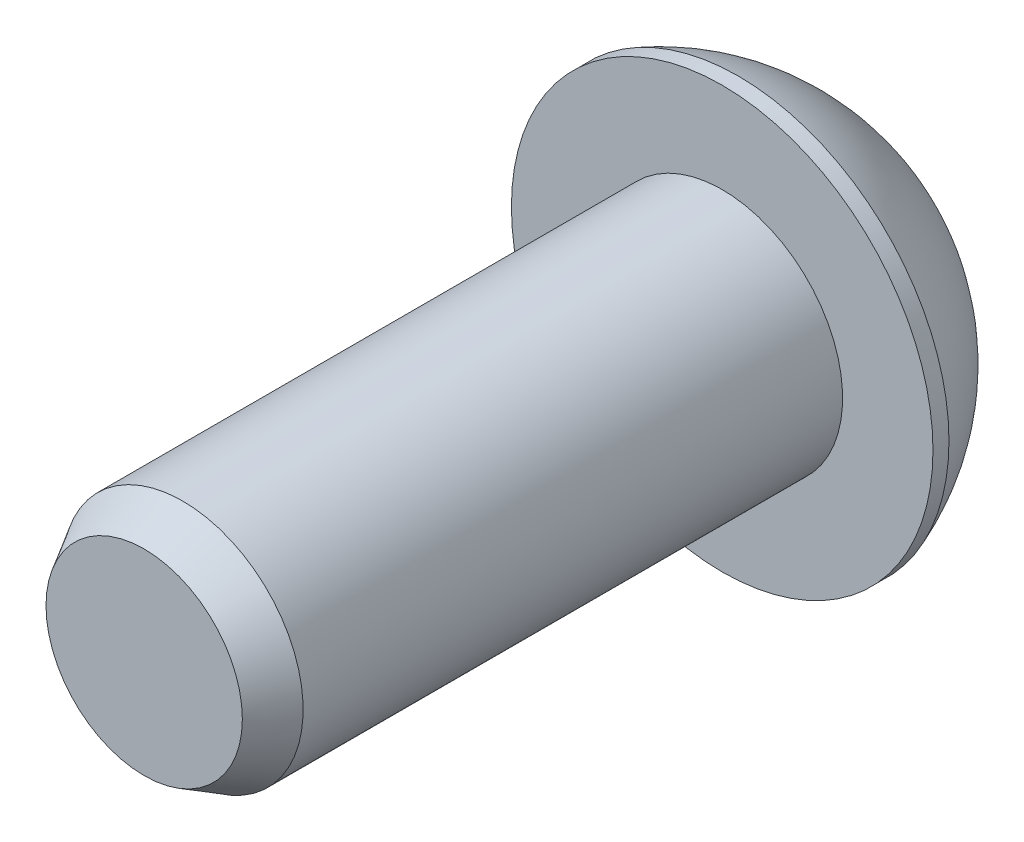
ISO-10303-21;
HEADER;
FILE_DESCRIPTION(('STEP AP214'),'2;1');
FILE_NAME('part.step','',(''),(''),'','','');
FILE_SCHEMA(('AUTOMOTIVE_DESIGN { 1 0 10303 214 1 1 1 1 }'));
ENDSEC;
DATA;
#1=APPLICATION_CONTEXT('core data for automotive mechanical design processes');
#2=APPLICATION_PROTOCOL_DEFINITION('international standard','automotive_design',2000,#1);
#3=PRODUCT_CONTEXT('',#1,'mechanical');
#4=PRODUCT('Part','Part','',(#3));
#5=PRODUCT_RELATED_PRODUCT_CATEGORY('part','',(#4));
#6=PRODUCT_DEFINITION_FORMATION('','',#4);
#7=PRODUCT_DEFINITION_CONTEXT('part definition',#1,'design');
#8=PRODUCT_DEFINITION('design','',#6,#7);
#9=PRODUCT_DEFINITION_SHAPE('','',#8);
#10=(LENGTH_UNIT() NAMED_UNIT(*) SI_UNIT(.MILLI.,.METRE.));
#11=(NAMED_UNIT(*) PLANE_ANGLE_UNIT() SI_UNIT($,.RADIAN.));
#12=(NAMED_UNIT(*) SI_UNIT($,.STERADIAN.) SOLID_ANGLE_UNIT());
#13=UNCERTAINTY_MEASURE_WITH_UNIT(LENGTH_MEASURE(1.E-05),#10,'distance_accuracy_value','');
#14=(GEOMETRIC_REPRESENTATION_CONTEXT(3) GLOBAL_UNCERTAINTY_ASSIGNED_CONTEXT((#13)) GLOBAL_UNIT_ASSIGNED_CONTEXT((#10,
#11,#12)) REPRESENTATION_CONTEXT('',''));
#15=CARTESIAN_POINT('',(0.,0.,0.));
#16=DIRECTION('',(0.,0.,1.));
#17=DIRECTION('',(1.,0.,0.));
#18=AXIS2_PLACEMENT_3D('',#15,#16,#17);
#19=CARTESIAN_POINT('',(6.94689994485843,0.,4.21640000000001));
#20=DIRECTION('',(0.,0.,1.));
#21=DIRECTION('',(1.,0.,0.));
#22=AXIS2_PLACEMENT_3D('',#19,#20,#21);
#23=PLANE('',#22);
#24=CARTESIAN_POINT('',(-2.84133281139298E-08,0.,4.21640000000001));
#25=DIRECTION('',(0.,0.,1.));
#26=DIRECTION('',(1.,0.,0.));
#27=AXIS2_PLACEMENT_3D('',#24,#25,#26);
#28=CIRCLE('',#27,6.94689997327175);
#29=CARTESIAN_POINT('',(6.94689994485843,0.,4.21640000000001));
#30=VERTEX_POINT('',#29);
#31=EDGE_CURVE('E145',#30,#30,#28,.T.);
#32=ORIENTED_EDGE('',*,*,#31,.T.);
#33=EDGE_LOOP('',(#32));
#34=FACE_BOUND('',#33,.T.);
#35=CARTESIAN_POINT('',(0.,0.,4.21640000000001));
#36=DIRECTION('',(0.,0.,1.));
#37=DIRECTION('',(1.,0.,0.));
#38=AXIS2_PLACEMENT_3D('',#35,#36,#37);
#39=CIRCLE('',#38,3.96875);
#40=CARTESIAN_POINT('',(-3.96875,0.,4.21640000000001));
#41=VERTEX_POINT('',#40);
#42=EDGE_CURVE('E124',#41,#41,#39,.T.);
#43=ORIENTED_EDGE('',*,*,#42,.F.);
#44=EDGE_LOOP('',(#43));
#45=FACE_BOUND('',#44,.T.);
#46=ADVANCED_FACE('F34',(#34,#45),#23,.T.);
#47=CARTESIAN_POINT('',(-2.67282055155249E-08,0.,6.25721458691914));
#48=DIRECTION('',(0.,0.,1.));
#49=DIRECTION('',(1.,0.,0.));
#50=AXIS2_PLACEMENT_3D('',#47,#48,#49);
#51=SPHERICAL_SURFACE('',#50,7.40630461839997);
#52=CARTESIAN_POINT('',(-2.84133281139298E-08,0.,0.));
#53=DIRECTION('',(0.,0.,1.));
#54=DIRECTION('',(1.,0.,0.));
#55=AXIS2_PLACEMENT_3D('',#52,#53,#54);
#56=CIRCLE('',#55,3.96239999585268);
#57=CARTESIAN_POINT('',(3.96239996743935,0.,0.));
#58=VERTEX_POINT('',#57);
#59=EDGE_CURVE('E148',#58,#58,#56,.T.);
#60=CARTESIAN_POINT('',(-2.84133281139298E-08,0.,3.68934993213253));
#61=DIRECTION('',(0.,0.,1.));
#62=DIRECTION('',(1.,0.,0.));
#63=AXIS2_PLACEMENT_3D('',#60,#61,#62);
#64=CIRCLE('',#63,6.94689997327175);
#65=CARTESIAN_POINT('',(6.94689994485843,0.,3.68934993213253));
#66=VERTEX_POINT('',#65);
#67=EDGE_CURVE('E137',#66,#66,#64,.T.);
#68=CARTESIAN_POINT('',(3.96239996743935,0.,0.));
#69=CARTESIAN_POINT('',(4.00491122832903,0.,0.0269202935423318));
#70=CARTESIAN_POINT('',(4.04714806312185,0.,0.0542739413594867));
#71=CARTESIAN_POINT('',(4.13105552059287,0.,0.10983630254456));
#72=CARTESIAN_POINT('',(4.17272614327109,0.,0.138045015912478));
#73=CARTESIAN_POINT('',(4.25548381659206,0.,0.195305865200196));
#74=CARTESIAN_POINT('',(4.29657086723481,0.,0.224358001119995));
#75=CARTESIAN_POINT('',(4.37814434200689,0.,0.283293606974706));
#76=CARTESIAN_POINT('',(4.41863076613622,0.,0.313177076909618));
#77=CARTESIAN_POINT('',(4.49898616602004,0.,0.373762942419019));
#78=CARTESIAN_POINT('',(4.53885514177452,0.,0.404465337993508));
#79=CARTESIAN_POINT('',(4.61795908406372,0.,0.466676299386842));
#80=CARTESIAN_POINT('',(4.65719405059842,0.,0.498184865205687));
#81=CARTESIAN_POINT('',(4.73501367576176,0.,0.561995078635741));
#82=CARTESIAN_POINT('',(4.77359833439039,0.,0.594296726246949));
#83=CARTESIAN_POINT('',(4.85010131552178,0.,0.659679684868404));
#84=CARTESIAN_POINT('',(4.88801963802453,0.,0.69276099587865));
#85=CARTESIAN_POINT('',(4.96317419539715,0.,0.75968953915967));
#86=CARTESIAN_POINT('',(5.00041043026703,0.,0.793536771430443));
#87=CARTESIAN_POINT('',(5.07418534423334,0.,0.861983096890693));
#88=CARTESIAN_POINT('',(5.11072402332977,0.,0.89658219008017));
#89=CARTESIAN_POINT('',(5.18308864737106,0.,0.966517864718109));
#90=CARTESIAN_POINT('',(5.21891459231591,0.,1.00185444616657));
#91=CARTESIAN_POINT('',(5.28983886575141,0.,1.07325041830338));
#92=CARTESIAN_POINT('',(5.32493719424207,0.,1.10930980899173));
#93=CARTESIAN_POINT('',(5.39439165472216,0.,1.18213642033078));
#94=CARTESIAN_POINT('',(5.4287477867116,0.,1.21890364098148));
#95=CARTESIAN_POINT('',(5.49670358245505,0.,1.29313063893092));
#96=CARTESIAN_POINT('',(5.53030324620907,0.,1.33059041622965));
#97=CARTESIAN_POINT('',(5.59673214798866,0.,1.40618696646884));
#98=CARTESIAN_POINT('',(5.62956138601425,0.,1.44432373940931));
#99=CARTESIAN_POINT('',(5.69443579888326,0.,1.52125843869782));
#100=CARTESIAN_POINT('',(5.72648097372668,0.,1.56005636504585));
#101=CARTESIAN_POINT('',(5.78977394848199,0.,1.6382972542684));
#102=CARTESIAN_POINT('',(5.82102174839387,0.,1.67774021714292));
#103=CARTESIAN_POINT('',(5.88270699277081,0.,1.75725479458547));
#104=CARTESIAN_POINT('',(5.91314443723587,0.,1.79732640915351));
#105=CARTESIAN_POINT('',(5.97319632683021,0.,1.87808164400463));
#106=CARTESIAN_POINT('',(6.00281077195948,0.,1.91876526428772));
#107=CARTESIAN_POINT('',(6.06120436087193,0.,2.00072761035977));
#108=CARTESIAN_POINT('',(6.08998350465511,0.,2.04200633614874));
#109=CARTESIAN_POINT('',(6.14669453585395,0.,2.12514174581318));
#110=CARTESIAN_POINT('',(6.17462642326962,0.,2.16699842968865));
#111=CARTESIAN_POINT('',(6.22963133866741,0.,2.25127236801952));
#112=CARTESIAN_POINT('',(6.25670436664953,0.,2.29368962247493));
#113=CARTESIAN_POINT('',(6.30998031688856,0.,2.37906708159517));
#114=CARTESIAN_POINT('',(6.33618323914547,0.,2.42202728626001));
#115=CARTESIAN_POINT('',(6.38770809309214,0.,2.50847279988288));
#116=CARTESIAN_POINT('',(6.4130300247819,0.,2.5519581088409));
#117=CARTESIAN_POINT('',(6.46278237871033,0.,2.63943576700672));
#118=CARTESIAN_POINT('',(6.487212800949,0.,2.6834281162145));
#119=CARTESIAN_POINT('',(6.53517198746878,0.,2.77190158019351));
#120=CARTESIAN_POINT('',(6.55870075174988,0.,2.81638269496474));
#121=CARTESIAN_POINT('',(6.60484684825518,0.,2.90581521240596));
#122=CARTESIAN_POINT('',(6.62746418047938,0.,2.95076661507596));
#123=CARTESIAN_POINT('',(6.67177801793329,0.,3.04112103507456));
#124=CARTESIAN_POINT('',(6.693474523163,0.,3.08652405240316));
#125=CARTESIAN_POINT('',(6.73593769216331,0.,3.17776284167868));
#126=CARTESIAN_POINT('',(6.7567043559339,0.,3.22359861362559));
#127=CARTESIAN_POINT('',(6.7972992214406,0.,3.31568386933109));
#128=CARTESIAN_POINT('',(6.81712742317669,0.,3.36193335308968));
#129=CARTESIAN_POINT('',(6.85583710541432,0.,3.45482682894085));
#130=CARTESIAN_POINT('',(6.87471858591584,0.,3.50147082103345));
#131=CARTESIAN_POINT('',(6.91152706599869,0.,3.59513390444256));
#132=CARTESIAN_POINT('',(6.92945406558002,0.,3.64215299575909));
#133=CARTESIAN_POINT('',(6.94689994485843,0.,3.68934993213253));
#134=B_SPLINE_CURVE_WITH_KNOTS('',3,(#68,#69,#70,#71,#72,#73,#74,#75,#76,#77,#78,#79,#80,#81,
#82,#83,#84,#85,#86,#87,#88,#89,#90,#91,#92,#93,#94,#95,#96,#97,#98,#99,#100,#101,#102,#103,
#104,#105,#106,#107,#108,#109,#110,#111,#112,#113,#114,#115,#116,#117,#118,#119,#120,#121,#122,
#123,#124,#125,#126,#127,#128,#129,#130,#131,#132,#133),.UNSPECIFIED.,.F.,.F.,(4,2,2,2,2,2,2,2,
2,2,2,2,2,2,2,2,2,2,2,2,2,2,2,2,2,2,2,2,2,2,2,2,4),(0.,0.15095163248343,0.301903264966859,
0.452854897450289,0.603806529933719,0.754758162417149,0.905709794900579,1.05666142738401,
1.20761305986744,1.35856469235087,1.5095163248343,1.66046795731773,1.81141958980116,
1.96237122228459,2.11332285476802,2.26427448725145,2.41522611973488,2.56617775221831,
2.71712938470174,2.86808101718517,3.0190326496686,3.16998428215203,3.32093591463546,
3.47188754711889,3.62283917960231,3.77379081208575,3.92474244456917,4.0756940770526,
4.22664570953603,4.37759734201946,4.52854897450289,4.67950060698632,4.83045223946975),.UNSPECIFIED.);
#135=EDGE_CURVE('BSEAM165',#58,#66,#134,.T.);
#136=ORIENTED_EDGE('',*,*,#59,.T.);
#137=ORIENTED_EDGE('',*,*,#67,.F.);
#138=ORIENTED_EDGE('',*,*,#135,.T.);
#139=ORIENTED_EDGE('',*,*,#135,.F.);
#140=EDGE_LOOP('',(#136,#138,#137,#139));
#141=FACE_BOUND('',#140,.T.);
#142=ADVANCED_FACE('F165',(#141),#51,.T.);
#143=CARTESIAN_POINT('',(-2.84133281139298E-08,0.,0.));
#144=DIRECTION('',(0.,0.,-1.));
#145=DIRECTION('',(-1.,0.,0.));
#146=AXIS2_PLACEMENT_3D('',#143,#144,#145);
#147=PLANE('',#146);
#148=DIRECTION('',(-0.5,0.866025403784439,0.));
#149=VECTOR('',#148,1.);
#150=CARTESIAN_POINT('',(-1.3748153285078,-2.38125,0.));
#151=LINE('',#150,#149);
#152=CARTESIAN_POINT('',(-1.3748153285078,-2.38125,0.));
#153=VERTEX_POINT('',#152);
#154=CARTESIAN_POINT('',(-2.74963065701559,0.,0.));
#155=VERTEX_POINT('',#154);
#156=EDGE_CURVE('E49',#153,#155,#151,.T.);
#157=ORIENTED_EDGE('',*,*,#156,.F.);
#158=DIRECTION('',(-1.,0.,0.));
#159=VECTOR('',#158,1.);
#160=CARTESIAN_POINT('',(1.3748153285078,-2.38125,0.));
#161=LINE('',#160,#159);
#162=CARTESIAN_POINT('',(1.3748153285078,-2.38125,0.));
#163=VERTEX_POINT('',#162);
#164=EDGE_CURVE('E133',#163,#153,#161,.T.);
#165=ORIENTED_EDGE('',*,*,#164,.F.);
#166=DIRECTION('',(-0.500000000000001,-0.866025403784438,0.));
#167=VECTOR('',#166,1.);
#168=CARTESIAN_POINT('',(2.7496306570156,0.,0.));
#169=LINE('',#168,#167);
#170=CARTESIAN_POINT('',(2.7496306570156,0.,0.));
#171=VERTEX_POINT('',#170);
#172=EDGE_CURVE('E131',#171,#163,#169,.T.);
#173=ORIENTED_EDGE('',*,*,#172,.F.);
#174=DIRECTION('',(0.5,-0.866025403784439,0.));
#175=VECTOR('',#174,1.);
#176=CARTESIAN_POINT('',(1.3748153285078,2.38125,0.));
#177=LINE('',#176,#175);
#178=CARTESIAN_POINT('',(1.3748153285078,2.38125,0.));
#179=VERTEX_POINT('',#178);
#180=EDGE_CURVE('E97',#179,#171,#177,.T.);
#181=ORIENTED_EDGE('',*,*,#180,.F.);
#182=DIRECTION('',(1.,0.,0.));
#183=VECTOR('',#182,1.);
#184=CARTESIAN_POINT('',(-1.3748153285078,2.38125,0.));
#185=LINE('',#184,#183);
#186=CARTESIAN_POINT('',(-1.3748153285078,2.38125,0.));
#187=VERTEX_POINT('',#186);
#188=EDGE_CURVE('E127',#187,#179,#185,.T.);
#189=ORIENTED_EDGE('',*,*,#188,.F.);
#190=DIRECTION('',(0.5,0.866025403784439,0.));
#191=VECTOR('',#190,1.);
#192=CARTESIAN_POINT('',(-2.74963065701559,0.,0.));
#193=LINE('',#192,#191);
#194=EDGE_CURVE('E123',#155,#187,#193,.T.);
#195=ORIENTED_EDGE('',*,*,#194,.F.);
#196=EDGE_LOOP('',(#157,#165,#173,#181,#189,#195));
#197=FACE_BOUND('',#196,.T.);
#198=ORIENTED_EDGE('',*,*,#59,.F.);
#199=EDGE_LOOP('',(#198));
#200=FACE_BOUND('',#199,.T.);
#201=ADVANCED_FACE('F171',(#197,#200),#147,.T.);
#202=CARTESIAN_POINT('',(-2.84133281139298E-08,0.,0.));
#203=DIRECTION('',(0.,0.,1.));
#204=DIRECTION('',(1.,0.,0.));
#205=AXIS2_PLACEMENT_3D('',#202,#203,#204);
#206=CYLINDRICAL_SURFACE('',#205,6.94689997327175);
#207=ORIENTED_EDGE('',*,*,#67,.T.);
#208=EDGE_LOOP('',(#207));
#209=FACE_BOUND('',#208,.T.);
#210=ORIENTED_EDGE('',*,*,#31,.F.);
#211=EDGE_LOOP('',(#210));
#212=FACE_BOUND('',#211,.T.);
#213=ADVANCED_FACE('F176',(#209,#212),#206,.T.);
#214=CARTESIAN_POINT('',(-1.3748153285078,-2.38125,2.2225));
#215=DIRECTION('',(-0.866025403784439,-0.5,0.));
#216=DIRECTION('',(0.5,-0.866025403784439,0.));
#217=AXIS2_PLACEMENT_3D('',#214,#215,#216);
#218=PLANE('',#217);
#219=ORIENTED_EDGE('',*,*,#156,.T.);
#220=DIRECTION('',(0.,0.,-1.));
#221=VECTOR('',#220,1.);
#222=CARTESIAN_POINT('',(-2.74963065701559,0.,2.2225));
#223=LINE('',#222,#221);
#224=CARTESIAN_POINT('',(-2.74963065701559,0.,2.2225));
#225=VERTEX_POINT('',#224);
#226=EDGE_CURVE('E79',#225,#155,#223,.T.);
#227=ORIENTED_EDGE('',*,*,#226,.F.);
#228=DIRECTION('',(-0.5,0.866025403784439,0.));
#229=VECTOR('',#228,1.);
#230=CARTESIAN_POINT('',(-1.3748153285078,-2.38125,2.2225));
#231=LINE('',#230,#229);
#232=CARTESIAN_POINT('',(-1.3748153285078,-2.38125,2.2225));
#233=VERTEX_POINT('',#232);
#234=EDGE_CURVE('E135',#233,#225,#231,.T.);
#235=ORIENTED_EDGE('',*,*,#234,.F.);
#236=DIRECTION('',(0.,0.,-1.));
#237=VECTOR('',#236,1.);
#238=CARTESIAN_POINT('',(-1.3748153285078,-2.38125,2.2225));
#239=LINE('',#238,#237);
#240=EDGE_CURVE('E57',#233,#153,#239,.T.);
#241=ORIENTED_EDGE('',*,*,#240,.T.);
#242=EDGE_LOOP('',(#219,#227,#235,#241));
#243=FACE_BOUND('',#242,.T.);
#244=ADVANCED_FACE('F183',(#243),#218,.F.);
#245=CARTESIAN_POINT('',(1.3748153285078,-2.38125,2.2225));
#246=DIRECTION('',(0.,-1.,0.));
#247=DIRECTION('',(1.,0.,0.));
#248=AXIS2_PLACEMENT_3D('',#245,#246,#247);
#249=PLANE('',#248);
#250=ORIENTED_EDGE('',*,*,#164,.T.);
#251=ORIENTED_EDGE('',*,*,#240,.F.);
#252=DIRECTION('',(-1.,0.,0.));
#253=VECTOR('',#252,1.);
#254=CARTESIAN_POINT('',(1.3748153285078,-2.38125,2.2225));
#255=LINE('',#254,#253);
#256=CARTESIAN_POINT('',(1.3748153285078,-2.38125,2.2225));
#257=VERTEX_POINT('',#256);
#258=EDGE_CURVE('E109',#257,#233,#255,.T.);
#259=ORIENTED_EDGE('',*,*,#258,.F.);
#260=DIRECTION('',(0.,0.,-1.));
#261=VECTOR('',#260,1.);
#262=CARTESIAN_POINT('',(1.3748153285078,-2.38125,2.2225));
#263=LINE('',#262,#261);
#264=EDGE_CURVE('E101',#257,#163,#263,.T.);
#265=ORIENTED_EDGE('',*,*,#264,.T.);
#266=EDGE_LOOP('',(#250,#251,#259,#265));
#267=FACE_BOUND('',#266,.T.);
#268=ADVANCED_FACE('F209',(#267),#249,.F.);
#269=CARTESIAN_POINT('',(2.7496306570156,0.,2.2225));
#270=DIRECTION('',(0.866025403784438,-0.500000000000001,0.));
#271=DIRECTION('',(0.500000000000001,0.866025403784438,0.));
#272=AXIS2_PLACEMENT_3D('',#269,#270,#271);
#273=PLANE('',#272);
#274=ORIENTED_EDGE('',*,*,#172,.T.);
#275=ORIENTED_EDGE('',*,*,#264,.F.);
#276=DIRECTION('',(-0.500000000000001,-0.866025403784438,0.));
#277=VECTOR('',#276,1.);
#278=CARTESIAN_POINT('',(2.7496306570156,0.,2.2225));
#279=LINE('',#278,#277);
#280=CARTESIAN_POINT('',(2.7496306570156,0.,2.2225));
#281=VERTEX_POINT('',#280);
#282=EDGE_CURVE('E105',#281,#257,#279,.T.);
#283=ORIENTED_EDGE('',*,*,#282,.F.);
#284=DIRECTION('',(0.,0.,-1.));
#285=VECTOR('',#284,1.);
#286=CARTESIAN_POINT('',(2.7496306570156,0.,2.2225));
#287=LINE('',#286,#285);
#288=EDGE_CURVE('E90',#281,#171,#287,.T.);
#289=ORIENTED_EDGE('',*,*,#288,.T.);
#290=EDGE_LOOP('',(#274,#275,#283,#289));
#291=FACE_BOUND('',#290,.T.);
#292=ADVANCED_FACE('F106',(#291),#273,.F.);
#293=CARTESIAN_POINT('',(1.3748153285078,2.38125,2.2225));
#294=DIRECTION('',(0.866025403784439,0.5,0.));
#295=DIRECTION('',(-0.5,0.866025403784439,0.));
#296=AXIS2_PLACEMENT_3D('',#293,#294,#295);
#297=PLANE('',#296);
#298=ORIENTED_EDGE('',*,*,#180,.T.);
#299=ORIENTED_EDGE('',*,*,#288,.F.);
#300=DIRECTION('',(0.5,-0.866025403784439,0.));
#301=VECTOR('',#300,1.);
#302=CARTESIAN_POINT('',(1.3748153285078,2.38125,2.2225));
#303=LINE('',#302,#301);
#304=CARTESIAN_POINT('',(1.3748153285078,2.38125,2.2225));
#305=VERTEX_POINT('',#304);
#306=EDGE_CURVE('E94',#305,#281,#303,.T.);
#307=ORIENTED_EDGE('',*,*,#306,.F.);
#308=DIRECTION('',(0.,0.,-1.));
#309=VECTOR('',#308,1.);
#310=CARTESIAN_POINT('',(1.3748153285078,2.38125,2.2225));
#311=LINE('',#310,#309);
#312=EDGE_CURVE('E102',#305,#179,#311,.T.);
#313=ORIENTED_EDGE('',*,*,#312,.T.);
#314=EDGE_LOOP('',(#298,#299,#307,#313));
#315=FACE_BOUND('',#314,.T.);
#316=ADVANCED_FACE('F92',(#315),#297,.F.);
#317=CARTESIAN_POINT('',(-1.3748153285078,2.38125,2.2225));
#318=DIRECTION('',(0.,1.,0.));
#319=DIRECTION('',(-1.,0.,0.));
#320=AXIS2_PLACEMENT_3D('',#317,#318,#319);
#321=PLANE('',#320);
#322=ORIENTED_EDGE('',*,*,#188,.T.);
#323=ORIENTED_EDGE('',*,*,#312,.F.);
#324=DIRECTION('',(1.,0.,0.));
#325=VECTOR('',#324,1.);
#326=CARTESIAN_POINT('',(-1.3748153285078,2.38125,2.2225));
#327=LINE('',#326,#325);
#328=CARTESIAN_POINT('',(-1.3748153285078,2.38125,2.2225));
#329=VERTEX_POINT('',#328);
#330=EDGE_CURVE('E115',#329,#305,#327,.T.);
#331=ORIENTED_EDGE('',*,*,#330,.F.);
#332=DIRECTION('',(0.,0.,-1.));
#333=VECTOR('',#332,1.);
#334=CARTESIAN_POINT('',(-1.3748153285078,2.38125,2.2225));
#335=LINE('',#334,#333);
#336=EDGE_CURVE('E140',#329,#187,#335,.T.);
#337=ORIENTED_EDGE('',*,*,#336,.T.);
#338=EDGE_LOOP('',(#322,#323,#331,#337));
#339=FACE_BOUND('',#338,.T.);
#340=ADVANCED_FACE('F216',(#339),#321,.F.);
#341=CARTESIAN_POINT('',(-2.74963065701559,0.,2.2225));
#342=DIRECTION('',(-0.866025403784439,0.5,0.));
#343=DIRECTION('',(-0.5,-0.866025403784439,0.));
#344=AXIS2_PLACEMENT_3D('',#341,#342,#343);
#345=PLANE('',#344);
#346=ORIENTED_EDGE('',*,*,#194,.T.);
#347=ORIENTED_EDGE('',*,*,#336,.F.);
#348=DIRECTION('',(0.5,0.866025403784439,0.));
#349=VECTOR('',#348,1.);
#350=CARTESIAN_POINT('',(-2.74963065701559,0.,2.2225));
#351=LINE('',#350,#349);
#352=EDGE_CURVE('E117',#225,#329,#351,.T.);
#353=ORIENTED_EDGE('',*,*,#352,.F.);
#354=ORIENTED_EDGE('',*,*,#226,.T.);
#355=EDGE_LOOP('',(#346,#347,#353,#354));
#356=FACE_BOUND('',#355,.T.);
#357=ADVANCED_FACE('F195',(#356),#345,.F.);
#358=CARTESIAN_POINT('',(-2.74963065701559,0.,2.2225));
#359=DIRECTION('',(0.,0.,-1.));
#360=DIRECTION('',(-1.,0.,0.));
#361=AXIS2_PLACEMENT_3D('',#358,#359,#360);
#362=PLANE('',#361);
#363=ORIENTED_EDGE('',*,*,#234,.T.);
#364=ORIENTED_EDGE('',*,*,#352,.T.);
#365=ORIENTED_EDGE('',*,*,#330,.T.);
#366=ORIENTED_EDGE('',*,*,#306,.T.);
#367=ORIENTED_EDGE('',*,*,#282,.T.);
#368=ORIENTED_EDGE('',*,*,#258,.T.);
#369=EDGE_LOOP('',(#363,#364,#365,#366,#367,#368));
#370=FACE_BOUND('',#369,.T.);
#371=ADVANCED_FACE('F112',(#370),#362,.T.);
#372=CARTESIAN_POINT('',(0.,0.,23.2664));
#373=DIRECTION('',(0.,0.,-1.));
#374=DIRECTION('',(-1.,0.,0.));
#375=AXIS2_PLACEMENT_3D('',#372,#373,#374);
#376=CYLINDRICAL_SURFACE('',#375,3.96875);
#377=CARTESIAN_POINT('',(0.,0.,21.9964));
#378=DIRECTION('',(0.,0.,1.));
#379=DIRECTION('',(1.,0.,0.));
#380=AXIS2_PLACEMENT_3D('',#377,#378,#379);
#381=CIRCLE('',#380,3.96875);
#382=CARTESIAN_POINT('',(-3.96875,0.,21.9964));
#383=VERTEX_POINT('',#382);
#384=EDGE_CURVE('E11',#383,#383,#381,.F.);
#385=CARTESIAN_POINT('',(-3.96875,0.,21.9964));
#386=CARTESIAN_POINT('',(-3.96875,0.,21.8111916666667));
#387=CARTESIAN_POINT('',(-3.96875,0.,21.6259833333334));
#388=CARTESIAN_POINT('',(-3.96875,0.,21.2555666666667));
#389=CARTESIAN_POINT('',(-3.96875,0.,21.0703583333334));
#390=CARTESIAN_POINT('',(-3.96875,0.,20.6999416666667));
#391=CARTESIAN_POINT('',(-3.96875,0.,20.5147333333334));
#392=CARTESIAN_POINT('',(-3.96875,0.,20.1443166666667));
#393=CARTESIAN_POINT('',(-3.96875,0.,19.9591083333334));
#394=CARTESIAN_POINT('',(-3.96875,0.,19.5886916666667));
#395=CARTESIAN_POINT('',(-3.96875,0.,19.4034833333334));
#396=CARTESIAN_POINT('',(-3.96875,0.,19.0330666666667));
#397=CARTESIAN_POINT('',(-3.96875,0.,18.8478583333334));
#398=CARTESIAN_POINT('',(-3.96875,0.,18.4774416666667));
#399=CARTESIAN_POINT('',(-3.96875,0.,18.2922333333334));
#400=CARTESIAN_POINT('',(-3.96875,0.,17.9218166666667));
#401=CARTESIAN_POINT('',(-3.96875,0.,17.7366083333334));
#402=CARTESIAN_POINT('',(-3.96875,0.,17.3661916666667));
#403=CARTESIAN_POINT('',(-3.96875,0.,17.1809833333334));
#404=CARTESIAN_POINT('',(-3.96875,0.,16.8105666666667));
#405=CARTESIAN_POINT('',(-3.96875,0.,16.6253583333334));
#406=CARTESIAN_POINT('',(-3.96875,0.,16.2549416666667));
#407=CARTESIAN_POINT('',(-3.96875,0.,16.0697333333334));
#408=CARTESIAN_POINT('',(-3.96875,0.,15.6993166666667));
#409=CARTESIAN_POINT('',(-3.96875,0.,15.5141083333334));
#410=CARTESIAN_POINT('',(-3.96875,0.,15.1436916666667));
#411=CARTESIAN_POINT('',(-3.96875,0.,14.9584833333334));
#412=CARTESIAN_POINT('',(-3.96875,0.,14.5880666666667));
#413=CARTESIAN_POINT('',(-3.96875,0.,14.4028583333334));
#414=CARTESIAN_POINT('',(-3.96875,0.,14.0324416666667));
#415=CARTESIAN_POINT('',(-3.96875,0.,13.8472333333334));
#416=CARTESIAN_POINT('',(-3.96875,0.,13.4768166666667));
#417=CARTESIAN_POINT('',(-3.96875,0.,13.2916083333334));
#418=CARTESIAN_POINT('',(-3.96875,0.,12.9211916666667));
#419=CARTESIAN_POINT('',(-3.96875,0.,12.7359833333334));
#420=CARTESIAN_POINT('',(-3.96875,0.,12.3655666666667));
#421=CARTESIAN_POINT('',(-3.96875,0.,12.1803583333334));
#422=CARTESIAN_POINT('',(-3.96875,0.,11.8099416666667));
#423=CARTESIAN_POINT('',(-3.96875,0.,11.6247333333334));
#424=CARTESIAN_POINT('',(-3.96875,0.,11.2543166666667));
#425=CARTESIAN_POINT('',(-3.96875,0.,11.0691083333334));
#426=CARTESIAN_POINT('',(-3.96875,0.,10.6986916666667));
#427=CARTESIAN_POINT('',(-3.96875,0.,10.5134833333334));
#428=CARTESIAN_POINT('',(-3.96875,0.,10.1430666666667));
#429=CARTESIAN_POINT('',(-3.96875,0.,9.95785833333335));
#430=CARTESIAN_POINT('',(-3.96875,0.,9.58744166666668));
#431=CARTESIAN_POINT('',(-3.96875,0.,9.40223333333335));
#432=CARTESIAN_POINT('',(-3.96875,0.,9.03181666666668));
#433=CARTESIAN_POINT('',(-3.96875,0.,8.84660833333335));
#434=CARTESIAN_POINT('',(-3.96875,0.,8.47619166666668));
#435=CARTESIAN_POINT('',(-3.96875,0.,8.29098333333335));
#436=CARTESIAN_POINT('',(-3.96875,0.,7.92056666666668));
#437=CARTESIAN_POINT('',(-3.96875,0.,7.73535833333335));
#438=CARTESIAN_POINT('',(-3.96875,0.,7.36494166666668));
#439=CARTESIAN_POINT('',(-3.96875,0.,7.17973333333335));
#440=CARTESIAN_POINT('',(-3.96875,0.,6.80931666666668));
#441=CARTESIAN_POINT('',(-3.96875,0.,6.62410833333335));
#442=CARTESIAN_POINT('',(-3.96875,0.,6.25369166666668));
#443=CARTESIAN_POINT('',(-3.96875,0.,6.06848333333334));
#444=CARTESIAN_POINT('',(-3.96875,0.,5.69806666666668));
#445=CARTESIAN_POINT('',(-3.96875,0.,5.51285833333334));
#446=CARTESIAN_POINT('',(-3.96875,0.,5.14244166666668));
#447=CARTESIAN_POINT('',(-3.96875,0.,4.95723333333334));
#448=CARTESIAN_POINT('',(-3.96875,0.,4.58681666666668));
#449=CARTESIAN_POINT('',(-3.96875,0.,4.40160833333334));
#450=CARTESIAN_POINT('',(-3.96875,0.,4.21640000000001));
#451=B_SPLINE_CURVE_WITH_KNOTS('',3,(#385,#386,#387,#388,#389,#390,#391,#392,#393,#394,#395,
#396,#397,#398,#399,#400,#401,#402,#403,#404,#405,#406,#407,#408,#409,#410,#411,#412,#413,#414,
#415,#416,#417,#418,#419,#420,#421,#422,#423,#424,#425,#426,#427,#428,#429,#430,#431,#432,#433,
#434,#435,#436,#437,#438,#439,#440,#441,#442,#443,#444,#445,#446,#447,#448,#449,#450),
.UNSPECIFIED.,.F.,.F.,(4,2,2,2,2,2,2,2,2,2,2,2,2,2,2,2,2,2,2,2,2,2,2,2,2,2,2,2,2,2,2,2,4),(0.,
0.555625000000001,1.11125,1.666875,2.2225,2.778125,3.33375,3.889375,4.445,5.000625,
5.55625000000001,6.11187500000001,6.66750000000001,7.22312500000001,7.77875000000001,
8.33437500000001,8.89000000000001,9.44562500000001,10.00125,10.556875,11.1125,11.668125,
12.22375,12.779375,13.335,13.890625,14.44625,15.001875,15.5575,16.113125,16.66875,17.224375,
17.78),.UNSPECIFIED.);
#452=EDGE_CURVE('BSEAM161',#383,#41,#451,.T.);
#453=ORIENTED_EDGE('',*,*,#384,.T.);
#454=ORIENTED_EDGE('',*,*,#42,.T.);
#455=ORIENTED_EDGE('',*,*,#452,.T.);
#456=ORIENTED_EDGE('',*,*,#452,.F.);
#457=EDGE_LOOP('',(#453,#455,#454,#456));
#458=FACE_BOUND('',#457,.T.);
#459=ADVANCED_FACE('F161',(#458),#376,.T.);
#460=CARTESIAN_POINT('',(0.,0.,23.2664));
#461=DIRECTION('',(0.,0.,1.));
#462=DIRECTION('',(1.,0.,0.));
#463=AXIS2_PLACEMENT_3D('',#460,#461,#462);
#464=PLANE('',#463);
#465=CARTESIAN_POINT('',(0.,0.,23.2664));
#466=DIRECTION('',(0.,0.,1.));
#467=DIRECTION('',(1.,0.,0.));
#468=AXIS2_PLACEMENT_3D('',#465,#466,#467);
#469=CIRCLE('',#468,3.23551515812919);
#470=CARTESIAN_POINT('',(3.23551515812919,0.,23.2664));
#471=VERTEX_POINT('',#470);
#472=EDGE_CURVE('E42',#471,#471,#469,.T.);
#473=ORIENTED_EDGE('',*,*,#472,.T.);
#474=EDGE_LOOP('',(#473));
#475=FACE_BOUND('',#474,.T.);
#476=ADVANCED_FACE('F154',(#475),#464,.T.);
#477=CARTESIAN_POINT('',(0.,0.,23.2664));
#478=DIRECTION('',(0.,0.,-1.));
#479=DIRECTION('',(-1.,0.,0.));
#480=AXIS2_PLACEMENT_3D('',#477,#478,#479);
#481=CONICAL_SURFACE('',#480,3.23551515812919,0.523598775598295);
#482=ORIENTED_EDGE('',*,*,#384,.F.);
#483=EDGE_LOOP('',(#482));
#484=FACE_BOUND('',#483,.T.);
#485=ORIENTED_EDGE('',*,*,#472,.F.);
#486=EDGE_LOOP('',(#485));
#487=FACE_BOUND('',#486,.T.);
#488=ADVANCED_FACE('F36',(#484,#487),#481,.T.);
#489=CLOSED_SHELL('',(#46,#142,#201,#213,#244,#268,#292,#316,#340,#357,#371,#459,#476,#488));
#490=MANIFOLD_SOLID_BREP('B2',#489);
#491=ADVANCED_BREP_SHAPE_REPRESENTATION('',(#18,#490),#14);
#492=SHAPE_DEFINITION_REPRESENTATION(#9,#491);
ENDSEC;
END-ISO-10303-21;
